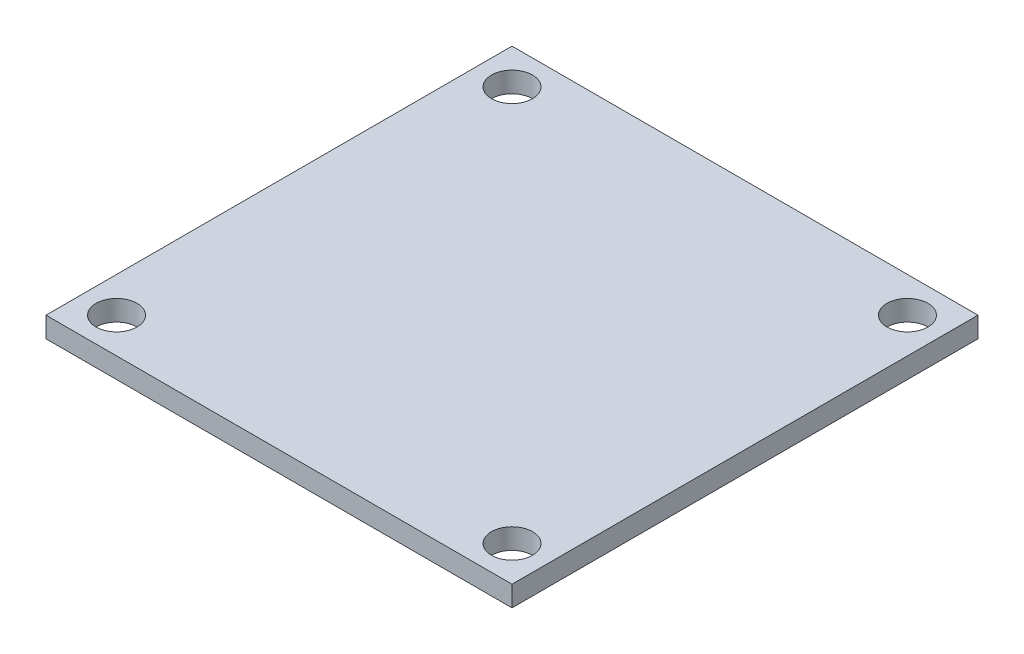
ISO-10303-21;
HEADER;
FILE_DESCRIPTION(('STEP AP214'),'2;1');
FILE_NAME('part.step','',(''),(''),'','','');
FILE_SCHEMA(('AUTOMOTIVE_DESIGN { 1 0 10303 214 1 1 1 1 }'));
ENDSEC;
DATA;
#1=APPLICATION_CONTEXT('core data for automotive mechanical design processes');
#2=APPLICATION_PROTOCOL_DEFINITION('international standard','automotive_design',2000,#1);
#3=PRODUCT_CONTEXT('',#1,'mechanical');
#4=PRODUCT('Part','Part','',(#3));
#5=PRODUCT_RELATED_PRODUCT_CATEGORY('part','',(#4));
#6=PRODUCT_DEFINITION_FORMATION('','',#4);
#7=PRODUCT_DEFINITION_CONTEXT('part definition',#1,'design');
#8=PRODUCT_DEFINITION('design','',#6,#7);
#9=PRODUCT_DEFINITION_SHAPE('','',#8);
#10=(LENGTH_UNIT() NAMED_UNIT(*) SI_UNIT(.MILLI.,.METRE.));
#11=(NAMED_UNIT(*) PLANE_ANGLE_UNIT() SI_UNIT($,.RADIAN.));
#12=(NAMED_UNIT(*) SI_UNIT($,.STERADIAN.) SOLID_ANGLE_UNIT());
#13=UNCERTAINTY_MEASURE_WITH_UNIT(LENGTH_MEASURE(1.E-05),#10,'distance_accuracy_value','');
#14=(GEOMETRIC_REPRESENTATION_CONTEXT(3) GLOBAL_UNCERTAINTY_ASSIGNED_CONTEXT((#13)) GLOBAL_UNIT_ASSIGNED_CONTEXT((#10,
#11,#12)) REPRESENTATION_CONTEXT('',''));
#15=CARTESIAN_POINT('',(0.,0.,0.));
#16=DIRECTION('',(0.,0.,1.));
#17=DIRECTION('',(1.,0.,0.));
#18=AXIS2_PLACEMENT_3D('',#15,#16,#17);
#19=CARTESIAN_POINT('',(0.,0.79375,0.));
#20=DIRECTION('',(0.,-1.,0.));
#21=DIRECTION('',(0.,0.,-1.));
#22=AXIS2_PLACEMENT_3D('',#19,#20,#21);
#23=PLANE('',#22);
#24=DIRECTION('',(0.,0.,-1.));
#25=VECTOR('',#24,1.);
#26=CARTESIAN_POINT('',(18.034,0.79375,18.034));
#27=LINE('',#26,#25);
#28=CARTESIAN_POINT('',(18.034,0.79375,18.034));
#29=VERTEX_POINT('',#28);
#30=CARTESIAN_POINT('',(18.034,0.79375,-18.034));
#31=VERTEX_POINT('',#30);
#32=EDGE_CURVE('E98',#29,#31,#27,.T.);
#33=ORIENTED_EDGE('',*,*,#32,.T.);
#34=DIRECTION('',(-1.,0.,0.));
#35=VECTOR('',#34,1.);
#36=CARTESIAN_POINT('',(-18.034,0.79375,-18.034));
#37=LINE('',#36,#35);
#38=CARTESIAN_POINT('',(-18.034,0.79375,-18.034));
#39=VERTEX_POINT('',#38);
#40=EDGE_CURVE('E93',#31,#39,#37,.T.);
#41=ORIENTED_EDGE('',*,*,#40,.T.);
#42=DIRECTION('',(0.,0.,1.));
#43=VECTOR('',#42,1.);
#44=CARTESIAN_POINT('',(-18.034,0.79375,18.034));
#45=LINE('',#44,#43);
#46=CARTESIAN_POINT('',(-18.034,0.79375,18.034));
#47=VERTEX_POINT('',#46);
#48=EDGE_CURVE('E96',#39,#47,#45,.T.);
#49=ORIENTED_EDGE('',*,*,#48,.T.);
#50=DIRECTION('',(1.,0.,0.));
#51=VECTOR('',#50,1.);
#52=CARTESIAN_POINT('',(-18.034,0.79375,18.034));
#53=LINE('',#52,#51);
#54=EDGE_CURVE('E63',#47,#29,#53,.T.);
#55=ORIENTED_EDGE('',*,*,#54,.T.);
#56=EDGE_LOOP('',(#33,#41,#49,#55));
#57=FACE_BOUND('',#56,.T.);
#58=CARTESIAN_POINT('',(-15.3035,0.79375,-15.3035));
#59=DIRECTION('',(0.,1.,0.));
#60=DIRECTION('',(0.,0.,1.));
#61=AXIS2_PLACEMENT_3D('',#58,#59,#60);
#62=CIRCLE('',#61,1.5875);
#63=CARTESIAN_POINT('',(-15.3035,0.79375,-13.716));
#64=VERTEX_POINT('',#63);
#65=EDGE_CURVE('E118',#64,#64,#62,.T.);
#66=ORIENTED_EDGE('',*,*,#65,.F.);
#67=EDGE_LOOP('',(#66));
#68=FACE_BOUND('',#67,.T.);
#69=CARTESIAN_POINT('',(-15.3035,0.79375,15.3035));
#70=DIRECTION('',(0.,1.,0.));
#71=DIRECTION('',(0.,0.,-1.));
#72=AXIS2_PLACEMENT_3D('',#69,#70,#71);
#73=CIRCLE('',#72,1.5875);
#74=CARTESIAN_POINT('',(-15.3035,0.79375,13.716));
#75=VERTEX_POINT('',#74);
#76=EDGE_CURVE('E140',#75,#75,#73,.T.);
#77=ORIENTED_EDGE('',*,*,#76,.F.);
#78=EDGE_LOOP('',(#77));
#79=FACE_BOUND('',#78,.T.);
#80=CARTESIAN_POINT('',(15.3035,0.79375,15.3035));
#81=DIRECTION('',(0.,1.,0.));
#82=DIRECTION('',(0.,0.,1.));
#83=AXIS2_PLACEMENT_3D('',#80,#81,#82);
#84=CIRCLE('',#83,1.5875);
#85=CARTESIAN_POINT('',(15.3035,0.79375,16.891));
#86=VERTEX_POINT('',#85);
#87=EDGE_CURVE('E148',#86,#86,#84,.T.);
#88=ORIENTED_EDGE('',*,*,#87,.F.);
#89=EDGE_LOOP('',(#88));
#90=FACE_BOUND('',#89,.T.);
#91=CARTESIAN_POINT('',(15.3035,0.79375,-15.3035));
#92=DIRECTION('',(0.,1.,0.));
#93=DIRECTION('',(0.,0.,-1.));
#94=AXIS2_PLACEMENT_3D('',#91,#92,#93);
#95=CIRCLE('',#94,1.5875);
#96=CARTESIAN_POINT('',(15.3035,0.79375,-16.891));
#97=VERTEX_POINT('',#96);
#98=EDGE_CURVE('E156',#97,#97,#95,.T.);
#99=ORIENTED_EDGE('',*,*,#98,.F.);
#100=EDGE_LOOP('',(#99));
#101=FACE_BOUND('',#100,.T.);
#102=ADVANCED_FACE('F45',(#57,#68,#79,#90,#101),#23,.F.);
#103=CARTESIAN_POINT('',(0.,-0.79375,0.));
#104=DIRECTION('',(0.,-1.,0.));
#105=DIRECTION('',(0.,0.,-1.));
#106=AXIS2_PLACEMENT_3D('',#103,#104,#105);
#107=PLANE('',#106);
#108=CARTESIAN_POINT('',(15.3035,-0.79375,15.3035));
#109=DIRECTION('',(0.,1.,0.));
#110=DIRECTION('',(0.,0.,1.));
#111=AXIS2_PLACEMENT_3D('',#108,#109,#110);
#112=CIRCLE('',#111,1.5875);
#113=CARTESIAN_POINT('',(15.3035,-0.79375,16.891));
#114=VERTEX_POINT('',#113);
#115=EDGE_CURVE('E152',#114,#114,#112,.T.);
#116=ORIENTED_EDGE('',*,*,#115,.T.);
#117=EDGE_LOOP('',(#116));
#118=FACE_BOUND('',#117,.T.);
#119=CARTESIAN_POINT('',(-15.3035,-0.79375,-15.3035));
#120=DIRECTION('',(0.,1.,0.));
#121=DIRECTION('',(0.,0.,1.));
#122=AXIS2_PLACEMENT_3D('',#119,#120,#121);
#123=CIRCLE('',#122,1.5875);
#124=CARTESIAN_POINT('',(-15.3035,-0.79375,-13.716));
#125=VERTEX_POINT('',#124);
#126=EDGE_CURVE('E136',#125,#125,#123,.T.);
#127=ORIENTED_EDGE('',*,*,#126,.T.);
#128=EDGE_LOOP('',(#127));
#129=FACE_BOUND('',#128,.T.);
#130=DIRECTION('',(0.,0.,-1.));
#131=VECTOR('',#130,1.);
#132=CARTESIAN_POINT('',(18.034,-0.79375,18.034));
#133=LINE('',#132,#131);
#134=CARTESIAN_POINT('',(18.034,-0.79375,18.034));
#135=VERTEX_POINT('',#134);
#136=CARTESIAN_POINT('',(18.034,-0.79375,-18.034));
#137=VERTEX_POINT('',#136);
#138=EDGE_CURVE('E114',#135,#137,#133,.T.);
#139=ORIENTED_EDGE('',*,*,#138,.F.);
#140=DIRECTION('',(1.,0.,0.));
#141=VECTOR('',#140,1.);
#142=CARTESIAN_POINT('',(-18.034,-0.79375,18.034));
#143=LINE('',#142,#141);
#144=CARTESIAN_POINT('',(-18.034,-0.79375,18.034));
#145=VERTEX_POINT('',#144);
#146=EDGE_CURVE('E86',#145,#135,#143,.T.);
#147=ORIENTED_EDGE('',*,*,#146,.F.);
#148=DIRECTION('',(0.,0.,1.));
#149=VECTOR('',#148,1.);
#150=CARTESIAN_POINT('',(-18.034,-0.79375,18.034));
#151=LINE('',#150,#149);
#152=CARTESIAN_POINT('',(-18.034,-0.79375,-18.034));
#153=VERTEX_POINT('',#152);
#154=EDGE_CURVE('E80',#153,#145,#151,.T.);
#155=ORIENTED_EDGE('',*,*,#154,.F.);
#156=DIRECTION('',(-1.,0.,0.));
#157=VECTOR('',#156,1.);
#158=CARTESIAN_POINT('',(-18.034,-0.79375,-18.034));
#159=LINE('',#158,#157);
#160=EDGE_CURVE('E103',#137,#153,#159,.T.);
#161=ORIENTED_EDGE('',*,*,#160,.F.);
#162=EDGE_LOOP('',(#139,#147,#155,#161));
#163=FACE_BOUND('',#162,.T.);
#164=CARTESIAN_POINT('',(-15.3035,-0.79375,15.3035));
#165=DIRECTION('',(0.,1.,0.));
#166=DIRECTION('',(0.,0.,-1.));
#167=AXIS2_PLACEMENT_3D('',#164,#165,#166);
#168=CIRCLE('',#167,1.5875);
#169=CARTESIAN_POINT('',(-15.3035,-0.79375,13.716));
#170=VERTEX_POINT('',#169);
#171=EDGE_CURVE('E144',#170,#170,#168,.T.);
#172=ORIENTED_EDGE('',*,*,#171,.T.);
#173=EDGE_LOOP('',(#172));
#174=FACE_BOUND('',#173,.T.);
#175=CARTESIAN_POINT('',(15.3035,-0.79375,-15.3035));
#176=DIRECTION('',(0.,1.,0.));
#177=DIRECTION('',(0.,0.,-1.));
#178=AXIS2_PLACEMENT_3D('',#175,#176,#177);
#179=CIRCLE('',#178,1.5875);
#180=CARTESIAN_POINT('',(15.3035,-0.79375,-16.891));
#181=VERTEX_POINT('',#180);
#182=EDGE_CURVE('E160',#181,#181,#179,.T.);
#183=ORIENTED_EDGE('',*,*,#182,.T.);
#184=EDGE_LOOP('',(#183));
#185=FACE_BOUND('',#184,.T.);
#186=ADVANCED_FACE('F131',(#118,#129,#163,#174,#185),#107,.T.);
#187=CARTESIAN_POINT('',(18.034,0.79375,18.034));
#188=DIRECTION('',(-1.,0.,0.));
#189=DIRECTION('',(0.,0.,1.));
#190=AXIS2_PLACEMENT_3D('',#187,#188,#189);
#191=PLANE('',#190);
#192=ORIENTED_EDGE('',*,*,#138,.T.);
#193=DIRECTION('',(0.,-1.,0.));
#194=VECTOR('',#193,1.);
#195=CARTESIAN_POINT('',(18.034,0.79375,-18.034));
#196=LINE('',#195,#194);
#197=EDGE_CURVE('E11',#31,#137,#196,.T.);
#198=ORIENTED_EDGE('',*,*,#197,.F.);
#199=ORIENTED_EDGE('',*,*,#32,.F.);
#200=DIRECTION('',(0.,-1.,0.));
#201=VECTOR('',#200,1.);
#202=CARTESIAN_POINT('',(18.034,0.79375,18.034));
#203=LINE('',#202,#201);
#204=EDGE_CURVE('E110',#29,#135,#203,.T.);
#205=ORIENTED_EDGE('',*,*,#204,.T.);
#206=EDGE_LOOP('',(#192,#198,#199,#205));
#207=FACE_BOUND('',#206,.T.);
#208=ADVANCED_FACE('F47',(#207),#191,.F.);
#209=CARTESIAN_POINT('',(-18.034,0.79375,-18.034));
#210=DIRECTION('',(0.,0.,1.));
#211=DIRECTION('',(1.,0.,0.));
#212=AXIS2_PLACEMENT_3D('',#209,#210,#211);
#213=PLANE('',#212);
#214=ORIENTED_EDGE('',*,*,#160,.T.);
#215=DIRECTION('',(0.,-1.,0.));
#216=VECTOR('',#215,1.);
#217=CARTESIAN_POINT('',(-18.034,0.79375,-18.034));
#218=LINE('',#217,#216);
#219=EDGE_CURVE('E55',#39,#153,#218,.T.);
#220=ORIENTED_EDGE('',*,*,#219,.F.);
#221=ORIENTED_EDGE('',*,*,#40,.F.);
#222=ORIENTED_EDGE('',*,*,#197,.T.);
#223=EDGE_LOOP('',(#214,#220,#221,#222));
#224=FACE_BOUND('',#223,.T.);
#225=ADVANCED_FACE('F102',(#224),#213,.F.);
#226=CARTESIAN_POINT('',(-18.034,0.79375,18.034));
#227=DIRECTION('',(1.,0.,0.));
#228=DIRECTION('',(0.,0.,-1.));
#229=AXIS2_PLACEMENT_3D('',#226,#227,#228);
#230=PLANE('',#229);
#231=ORIENTED_EDGE('',*,*,#154,.T.);
#232=DIRECTION('',(0.,-1.,0.));
#233=VECTOR('',#232,1.);
#234=CARTESIAN_POINT('',(-18.034,0.79375,18.034));
#235=LINE('',#234,#233);
#236=EDGE_CURVE('E105',#47,#145,#235,.T.);
#237=ORIENTED_EDGE('',*,*,#236,.F.);
#238=ORIENTED_EDGE('',*,*,#48,.F.);
#239=ORIENTED_EDGE('',*,*,#219,.T.);
#240=EDGE_LOOP('',(#231,#237,#238,#239));
#241=FACE_BOUND('',#240,.T.);
#242=ADVANCED_FACE('F106',(#241),#230,.F.);
#243=CARTESIAN_POINT('',(-18.034,0.79375,18.034));
#244=DIRECTION('',(0.,0.,-1.));
#245=DIRECTION('',(-1.,0.,0.));
#246=AXIS2_PLACEMENT_3D('',#243,#244,#245);
#247=PLANE('',#246);
#248=ORIENTED_EDGE('',*,*,#146,.T.);
#249=ORIENTED_EDGE('',*,*,#204,.F.);
#250=ORIENTED_EDGE('',*,*,#54,.F.);
#251=ORIENTED_EDGE('',*,*,#236,.T.);
#252=EDGE_LOOP('',(#248,#249,#250,#251));
#253=FACE_BOUND('',#252,.T.);
#254=ADVANCED_FACE('F128',(#253),#247,.F.);
#255=CARTESIAN_POINT('',(-15.3035,0.79375,-15.3035));
#256=DIRECTION('',(0.,-1.,0.));
#257=DIRECTION('',(0.,0.,-1.));
#258=AXIS2_PLACEMENT_3D('',#255,#256,#257);
#259=CYLINDRICAL_SURFACE('',#258,1.5875);
#260=ORIENTED_EDGE('',*,*,#65,.T.);
#261=EDGE_LOOP('',(#260));
#262=FACE_BOUND('',#261,.T.);
#263=ORIENTED_EDGE('',*,*,#126,.F.);
#264=EDGE_LOOP('',(#263));
#265=FACE_BOUND('',#264,.T.);
#266=ADVANCED_FACE('F179',(#262,#265),#259,.F.);
#267=CARTESIAN_POINT('',(-15.3035,0.79375,15.3035));
#268=DIRECTION('',(0.,-1.,0.));
#269=DIRECTION('',(0.,0.,-1.));
#270=AXIS2_PLACEMENT_3D('',#267,#268,#269);
#271=CYLINDRICAL_SURFACE('',#270,1.5875);
#272=ORIENTED_EDGE('',*,*,#76,.T.);
#273=EDGE_LOOP('',(#272));
#274=FACE_BOUND('',#273,.T.);
#275=ORIENTED_EDGE('',*,*,#171,.F.);
#276=EDGE_LOOP('',(#275));
#277=FACE_BOUND('',#276,.T.);
#278=ADVANCED_FACE('F224',(#274,#277),#271,.F.);
#279=CARTESIAN_POINT('',(15.3035,0.79375,15.3035));
#280=DIRECTION('',(0.,-1.,0.));
#281=DIRECTION('',(0.,0.,-1.));
#282=AXIS2_PLACEMENT_3D('',#279,#280,#281);
#283=CYLINDRICAL_SURFACE('',#282,1.5875);
#284=ORIENTED_EDGE('',*,*,#87,.T.);
#285=EDGE_LOOP('',(#284));
#286=FACE_BOUND('',#285,.T.);
#287=ORIENTED_EDGE('',*,*,#115,.F.);
#288=EDGE_LOOP('',(#287));
#289=FACE_BOUND('',#288,.T.);
#290=ADVANCED_FACE('F232',(#286,#289),#283,.F.);
#291=CARTESIAN_POINT('',(15.3035,0.79375,-15.3035));
#292=DIRECTION('',(0.,-1.,0.));
#293=DIRECTION('',(0.,0.,-1.));
#294=AXIS2_PLACEMENT_3D('',#291,#292,#293);
#295=CYLINDRICAL_SURFACE('',#294,1.5875);
#296=ORIENTED_EDGE('',*,*,#98,.T.);
#297=EDGE_LOOP('',(#296));
#298=FACE_BOUND('',#297,.T.);
#299=ORIENTED_EDGE('',*,*,#182,.F.);
#300=EDGE_LOOP('',(#299));
#301=FACE_BOUND('',#300,.T.);
#302=ADVANCED_FACE('F168',(#298,#301),#295,.F.);
#303=CLOSED_SHELL('',(#102,#186,#208,#225,#242,#254,#266,#278,#290,#302));
#304=MANIFOLD_SOLID_BREP('B2',#303);
#305=ADVANCED_BREP_SHAPE_REPRESENTATION('',(#18,#304),#14);
#306=SHAPE_DEFINITION_REPRESENTATION(#9,#305);
ENDSEC;
END-ISO-10303-21;
